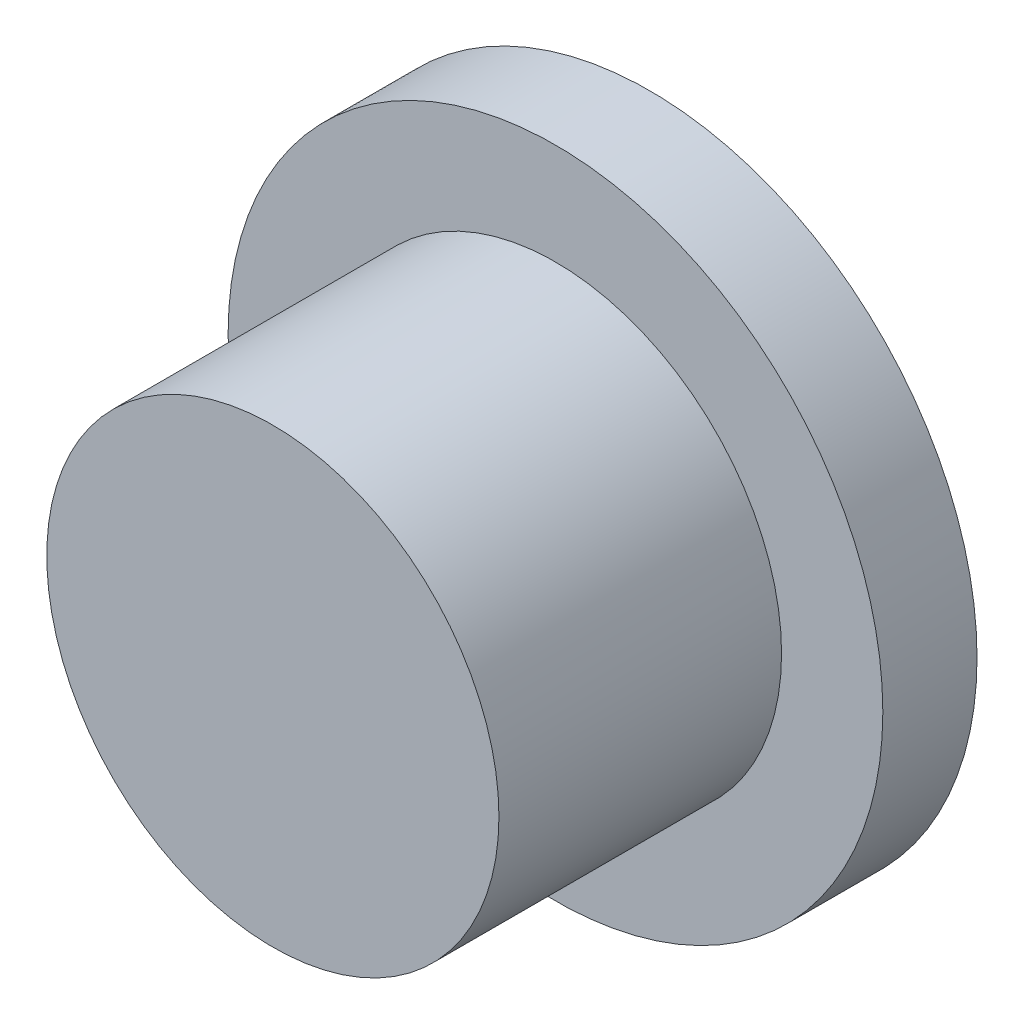
ISO-10303-21;
HEADER;
FILE_DESCRIPTION(('STEP AP214'),'2;1');
FILE_NAME('part.step','',(''),(''),'','','');
FILE_SCHEMA(('AUTOMOTIVE_DESIGN { 1 0 10303 214 1 1 1 1 }'));
ENDSEC;
DATA;
#1=APPLICATION_CONTEXT('core data for automotive mechanical design processes');
#2=APPLICATION_PROTOCOL_DEFINITION('international standard','automotive_design',2000,#1);
#3=PRODUCT_CONTEXT('',#1,'mechanical');
#4=PRODUCT('Part','Part','',(#3));
#5=PRODUCT_RELATED_PRODUCT_CATEGORY('part','',(#4));
#6=PRODUCT_DEFINITION_FORMATION('','',#4);
#7=PRODUCT_DEFINITION_CONTEXT('part definition',#1,'design');
#8=PRODUCT_DEFINITION('design','',#6,#7);
#9=PRODUCT_DEFINITION_SHAPE('','',#8);
#10=(LENGTH_UNIT() NAMED_UNIT(*) SI_UNIT(.MILLI.,.METRE.));
#11=(NAMED_UNIT(*) PLANE_ANGLE_UNIT() SI_UNIT($,.RADIAN.));
#12=(NAMED_UNIT(*) SI_UNIT($,.STERADIAN.) SOLID_ANGLE_UNIT());
#13=UNCERTAINTY_MEASURE_WITH_UNIT(LENGTH_MEASURE(1.E-05),#10,'distance_accuracy_value','');
#14=(GEOMETRIC_REPRESENTATION_CONTEXT(3) GLOBAL_UNCERTAINTY_ASSIGNED_CONTEXT((#13)) GLOBAL_UNIT_ASSIGNED_CONTEXT((#10,
#11,#12)) REPRESENTATION_CONTEXT('',''));
#15=CARTESIAN_POINT('',(0.,0.,0.));
#16=DIRECTION('',(0.,0.,1.));
#17=DIRECTION('',(1.,0.,0.));
#18=AXIS2_PLACEMENT_3D('',#15,#16,#17);
#19=CARTESIAN_POINT('',(0.,0.,2.));
#20=DIRECTION('',(0.,0.,1.));
#21=DIRECTION('',(1.,0.,0.));
#22=AXIS2_PLACEMENT_3D('',#19,#20,#21);
#23=PLANE('',#22);
#24=CARTESIAN_POINT('',(0.,0.,2.));
#25=DIRECTION('',(0.,0.,1.));
#26=DIRECTION('',(1.,0.,0.));
#27=AXIS2_PLACEMENT_3D('',#24,#25,#26);
#28=CIRCLE('',#27,6.95);
#29=CARTESIAN_POINT('',(6.95,0.,2.));
#30=VERTEX_POINT('',#29);
#31=EDGE_CURVE('E10',#30,#30,#28,.T.);
#32=ORIENTED_EDGE('',*,*,#31,.T.);
#33=EDGE_LOOP('',(#32));
#34=FACE_BOUND('',#33,.T.);
#35=CARTESIAN_POINT('',(0.,0.,2.));
#36=DIRECTION('',(0.,0.,1.));
#37=DIRECTION('',(1.,0.,0.));
#38=AXIS2_PLACEMENT_3D('',#35,#36,#37);
#39=CIRCLE('',#38,4.8);
#40=CARTESIAN_POINT('',(4.8,0.,2.));
#41=VERTEX_POINT('',#40);
#42=EDGE_CURVE('E44',#41,#41,#39,.T.);
#43=ORIENTED_EDGE('',*,*,#42,.F.);
#44=EDGE_LOOP('',(#43));
#45=FACE_BOUND('',#44,.T.);
#46=ADVANCED_FACE('F31',(#34,#45),#23,.T.);
#47=CARTESIAN_POINT('',(0.,0.,2.));
#48=DIRECTION('',(0.,0.,-1.));
#49=DIRECTION('',(-1.,0.,0.));
#50=AXIS2_PLACEMENT_3D('',#47,#48,#49);
#51=CYLINDRICAL_SURFACE('',#50,6.95);
#52=ORIENTED_EDGE('',*,*,#31,.F.);
#53=EDGE_LOOP('',(#52));
#54=FACE_BOUND('',#53,.T.);
#55=CARTESIAN_POINT('',(0.,0.,0.));
#56=DIRECTION('',(0.,0.,1.));
#57=DIRECTION('',(1.,0.,0.));
#58=AXIS2_PLACEMENT_3D('',#55,#56,#57);
#59=CIRCLE('',#58,6.95);
#60=CARTESIAN_POINT('',(6.95,0.,0.));
#61=VERTEX_POINT('',#60);
#62=EDGE_CURVE('E35',#61,#61,#59,.T.);
#63=ORIENTED_EDGE('',*,*,#62,.T.);
#64=EDGE_LOOP('',(#63));
#65=FACE_BOUND('',#64,.T.);
#66=ADVANCED_FACE('F33',(#54,#65),#51,.T.);
#67=CARTESIAN_POINT('',(0.,0.,0.));
#68=DIRECTION('',(0.,0.,1.));
#69=DIRECTION('',(1.,0.,0.));
#70=AXIS2_PLACEMENT_3D('',#67,#68,#69);
#71=PLANE('',#70);
#72=ORIENTED_EDGE('',*,*,#62,.F.);
#73=EDGE_LOOP('',(#72));
#74=FACE_BOUND('',#73,.T.);
#75=ADVANCED_FACE('F55',(#74),#71,.F.);
#76=CARTESIAN_POINT('',(0.,0.,8.));
#77=DIRECTION('',(0.,0.,-1.));
#78=DIRECTION('',(-1.,0.,0.));
#79=AXIS2_PLACEMENT_3D('',#76,#77,#78);
#80=CYLINDRICAL_SURFACE('',#79,4.8);
#81=CARTESIAN_POINT('',(0.,0.,8.));
#82=DIRECTION('',(0.,0.,1.));
#83=DIRECTION('',(1.,0.,0.));
#84=AXIS2_PLACEMENT_3D('',#81,#82,#83);
#85=CIRCLE('',#84,4.8);
#86=CARTESIAN_POINT('',(4.8,0.,8.));
#87=VERTEX_POINT('',#86);
#88=EDGE_CURVE('E42',#87,#87,#85,.T.);
#89=ORIENTED_EDGE('',*,*,#88,.F.);
#90=EDGE_LOOP('',(#89));
#91=FACE_BOUND('',#90,.T.);
#92=ORIENTED_EDGE('',*,*,#42,.T.);
#93=EDGE_LOOP('',(#92));
#94=FACE_BOUND('',#93,.T.);
#95=ADVANCED_FACE('F52',(#91,#94),#80,.T.);
#96=CARTESIAN_POINT('',(0.,-15.4314213562373,8.));
#97=DIRECTION('',(0.,0.,1.));
#98=DIRECTION('',(1.,0.,0.));
#99=AXIS2_PLACEMENT_3D('',#96,#97,#98);
#100=PLANE('',#99);
#101=ORIENTED_EDGE('',*,*,#88,.T.);
#102=EDGE_LOOP('',(#101));
#103=FACE_BOUND('',#102,.T.);
#104=ADVANCED_FACE('F50',(#103),#100,.T.);
#105=CLOSED_SHELL('',(#46,#66,#75,#95,#104));
#106=MANIFOLD_SOLID_BREP('B2',#105);
#107=ADVANCED_BREP_SHAPE_REPRESENTATION('',(#18,#106),#14);
#108=SHAPE_DEFINITION_REPRESENTATION(#9,#107);
ENDSEC;
END-ISO-10303-21;
